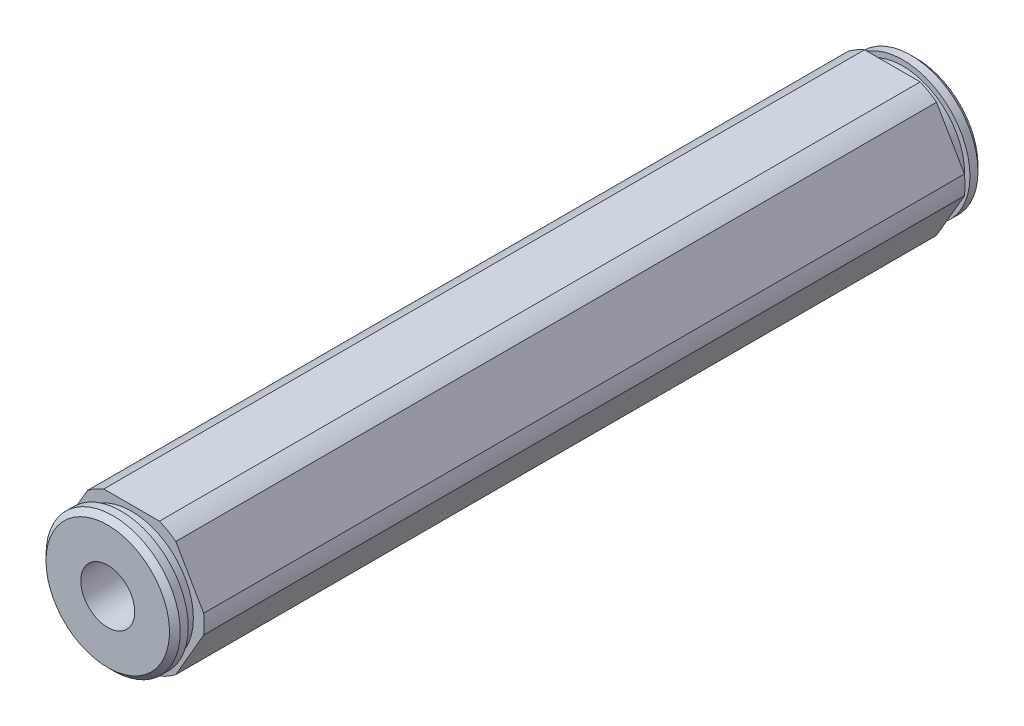
ISO-10303-21;
HEADER;
FILE_DESCRIPTION(('STEP AP214'),'2;1');
FILE_NAME('part.step','',(''),(''),'','','');
FILE_SCHEMA(('AUTOMOTIVE_DESIGN { 1 0 10303 214 1 1 1 1 }'));
ENDSEC;
DATA;
#1=APPLICATION_CONTEXT('core data for automotive mechanical design processes');
#2=APPLICATION_PROTOCOL_DEFINITION('international standard','automotive_design',2000,#1);
#3=PRODUCT_CONTEXT('',#1,'mechanical');
#4=PRODUCT('Part','Part','',(#3));
#5=PRODUCT_RELATED_PRODUCT_CATEGORY('part','',(#4));
#6=PRODUCT_DEFINITION_FORMATION('','',#4);
#7=PRODUCT_DEFINITION_CONTEXT('part definition',#1,'design');
#8=PRODUCT_DEFINITION('design','',#6,#7);
#9=PRODUCT_DEFINITION_SHAPE('','',#8);
#10=(LENGTH_UNIT() NAMED_UNIT(*) SI_UNIT(.MILLI.,.METRE.));
#11=(NAMED_UNIT(*) PLANE_ANGLE_UNIT() SI_UNIT($,.RADIAN.));
#12=(NAMED_UNIT(*) SI_UNIT($,.STERADIAN.) SOLID_ANGLE_UNIT());
#13=UNCERTAINTY_MEASURE_WITH_UNIT(LENGTH_MEASURE(1.E-05),#10,'distance_accuracy_value','');
#14=(GEOMETRIC_REPRESENTATION_CONTEXT(3) GLOBAL_UNCERTAINTY_ASSIGNED_CONTEXT((#13)) GLOBAL_UNIT_ASSIGNED_CONTEXT((#10,
#11,#12)) REPRESENTATION_CONTEXT('',''));
#15=CARTESIAN_POINT('',(0.,0.,0.));
#16=DIRECTION('',(0.,0.,1.));
#17=DIRECTION('',(1.,0.,0.));
#18=AXIS2_PLACEMENT_3D('',#15,#16,#17);
#19=CARTESIAN_POINT('',(0.,5.84199999999999,-2.26060000000002));
#20=DIRECTION('',(0.,0.,-1.));
#21=DIRECTION('',(-1.,0.,0.));
#22=AXIS2_PLACEMENT_3D('',#19,#20,#21);
#23=PLANE('',#22);
#24=CARTESIAN_POINT('',(0.,0.,-2.26060000000002));
#25=DIRECTION('',(0.,0.,1.));
#26=DIRECTION('',(1.,0.,0.));
#27=AXIS2_PLACEMENT_3D('',#24,#25,#26);
#28=CIRCLE('',#27,5.84199999999999);
#29=CARTESIAN_POINT('',(5.84199999999999,0.,-2.26060000000002));
#30=VERTEX_POINT('',#29);
#31=EDGE_CURVE('E194',#30,#30,#28,.T.);
#32=ORIENTED_EDGE('',*,*,#31,.F.);
#33=EDGE_LOOP('',(#32));
#34=FACE_BOUND('',#33,.T.);
#35=DIRECTION('',(0.5,0.866025403784439,0.));
#36=VECTOR('',#35,1.);
#37=CARTESIAN_POINT('',(-2.96960110957685,7.55649999999999,-2.26060000000002));
#38=LINE('',#37,#36);
#39=CARTESIAN_POINT('',(-6.81675182633099,0.893039494206786,-2.26060000000002));
#40=VERTEX_POINT('',#39);
#41=CARTESIAN_POINT('',(-4.18177080173138,5.45696050579321,-2.26060000000002));
#42=VERTEX_POINT('',#41);
#43=EDGE_CURVE('E139',#40,#42,#38,.T.);
#44=ORIENTED_EDGE('',*,*,#43,.F.);
#45=CARTESIAN_POINT('',(0.,0.,-2.26060000000002));
#46=DIRECTION('',(0.,0.,-1.));
#47=DIRECTION('',(-1.,0.,0.));
#48=AXIS2_PLACEMENT_3D('',#45,#46,#47);
#49=CIRCLE('',#48,6.875);
#50=CARTESIAN_POINT('',(-6.81675182633099,-0.893039494206791,-2.26060000000002));
#51=VERTEX_POINT('',#50);
#52=EDGE_CURVE('E183',#51,#40,#49,.T.);
#53=ORIENTED_EDGE('',*,*,#52,.F.);
#54=DIRECTION('',(-0.5,0.866025403784439,0.));
#55=VECTOR('',#54,1.);
#56=CARTESIAN_POINT('',(-8.02892151848553,1.20649999999999,-2.26060000000002));
#57=LINE('',#56,#55);
#58=CARTESIAN_POINT('',(-4.18177080173138,-5.45696050579321,-2.26060000000002));
#59=VERTEX_POINT('',#58);
#60=EDGE_CURVE('E171',#59,#51,#57,.T.);
#61=ORIENTED_EDGE('',*,*,#60,.F.);
#62=CARTESIAN_POINT('',(0.,0.,-2.26060000000002));
#63=DIRECTION('',(0.,0.,-1.));
#64=DIRECTION('',(-1.,0.,0.));
#65=AXIS2_PLACEMENT_3D('',#62,#63,#64);
#66=CIRCLE('',#65,6.875);
#67=CARTESIAN_POINT('',(-2.6349810245996,-6.35,-2.26060000000002));
#68=VERTEX_POINT('',#67);
#69=EDGE_CURVE('E181',#68,#59,#66,.T.);
#70=ORIENTED_EDGE('',*,*,#69,.F.);
#71=DIRECTION('',(-1.,0.,0.));
#72=VECTOR('',#71,1.);
#73=CARTESIAN_POINT('',(0.,-6.35,-2.26060000000002));
#74=LINE('',#73,#72);
#75=CARTESIAN_POINT('',(2.6349810245996,-6.35,-2.26060000000002));
#76=VERTEX_POINT('',#75);
#77=EDGE_CURVE('E167',#76,#68,#74,.T.);
#78=ORIENTED_EDGE('',*,*,#77,.F.);
#79=CARTESIAN_POINT('',(0.,0.,-2.26060000000002));
#80=DIRECTION('',(0.,0.,-1.));
#81=DIRECTION('',(-1.,0.,0.));
#82=AXIS2_PLACEMENT_3D('',#79,#80,#81);
#83=CIRCLE('',#82,6.875);
#84=CARTESIAN_POINT('',(4.18177080173138,-5.45696050579321,-2.26060000000002));
#85=VERTEX_POINT('',#84);
#86=EDGE_CURVE('E179',#85,#76,#83,.T.);
#87=ORIENTED_EDGE('',*,*,#86,.F.);
#88=DIRECTION('',(-0.499999999999999,-0.866025403784439,0.));
#89=VECTOR('',#88,1.);
#90=CARTESIAN_POINT('',(8.02892151848553,1.2065,-2.26060000000002));
#91=LINE('',#90,#89);
#92=CARTESIAN_POINT('',(6.81675182633099,-0.893039494206784,-2.26060000000002));
#93=VERTEX_POINT('',#92);
#94=EDGE_CURVE('E163',#93,#85,#91,.T.);
#95=ORIENTED_EDGE('',*,*,#94,.F.);
#96=CARTESIAN_POINT('',(0.,0.,-2.26060000000002));
#97=DIRECTION('',(0.,0.,-1.));
#98=DIRECTION('',(-1.,0.,0.));
#99=AXIS2_PLACEMENT_3D('',#96,#97,#98);
#100=CIRCLE('',#99,6.875);
#101=CARTESIAN_POINT('',(6.81675182633099,0.893039494206786,-2.26060000000002));
#102=VERTEX_POINT('',#101);
#103=EDGE_CURVE('E177',#102,#93,#100,.T.);
#104=ORIENTED_EDGE('',*,*,#103,.F.);
#105=DIRECTION('',(0.5,-0.866025403784438,0.));
#106=VECTOR('',#105,1.);
#107=CARTESIAN_POINT('',(2.96960110957684,7.55649999999999,-2.26060000000002));
#108=LINE('',#107,#106);
#109=CARTESIAN_POINT('',(4.18177080173138,5.45696050579321,-2.26060000000002));
#110=VERTEX_POINT('',#109);
#111=EDGE_CURVE('E155',#110,#102,#108,.T.);
#112=ORIENTED_EDGE('',*,*,#111,.F.);
#113=CARTESIAN_POINT('',(0.,0.,-2.26060000000002));
#114=DIRECTION('',(0.,0.,-1.));
#115=DIRECTION('',(-1.,0.,0.));
#116=AXIS2_PLACEMENT_3D('',#113,#114,#115);
#117=CIRCLE('',#116,6.875);
#118=CARTESIAN_POINT('',(2.6349810245996,6.35,-2.26060000000002));
#119=VERTEX_POINT('',#118);
#120=EDGE_CURVE('E138',#119,#110,#117,.T.);
#121=ORIENTED_EDGE('',*,*,#120,.F.);
#122=DIRECTION('',(1.,0.,0.));
#123=VECTOR('',#122,1.);
#124=CARTESIAN_POINT('',(0.,6.35,-2.26060000000002));
#125=LINE('',#124,#123);
#126=CARTESIAN_POINT('',(-2.63498102459961,6.35,-2.26060000000002));
#127=VERTEX_POINT('',#126);
#128=EDGE_CURVE('E144',#127,#119,#125,.T.);
#129=ORIENTED_EDGE('',*,*,#128,.F.);
#130=CARTESIAN_POINT('',(0.,0.,-2.26060000000002));
#131=DIRECTION('',(0.,0.,-1.));
#132=DIRECTION('',(-1.,0.,0.));
#133=AXIS2_PLACEMENT_3D('',#130,#131,#132);
#134=CIRCLE('',#133,6.875);
#135=EDGE_CURVE('E133',#42,#127,#134,.T.);
#136=ORIENTED_EDGE('',*,*,#135,.F.);
#137=EDGE_LOOP('',(#44,#53,#61,#70,#78,#87,#95,#104,#112,#121,#129,#136));
#138=FACE_BOUND('',#137,.T.);
#139=ADVANCED_FACE('F47',(#34,#138),#23,.F.);
#140=CARTESIAN_POINT('',(0.,0.,0.));
#141=DIRECTION('',(0.,0.,-1.));
#142=DIRECTION('',(-1.,0.,0.));
#143=AXIS2_PLACEMENT_3D('',#140,#141,#142);
#144=PLANE('',#143);
#145=CARTESIAN_POINT('',(0.,0.,0.));
#146=DIRECTION('',(0.,0.,-1.));
#147=DIRECTION('',(-1.,0.,0.));
#148=AXIS2_PLACEMENT_3D('',#145,#146,#147);
#149=CIRCLE('',#148,5.842);
#150=CARTESIAN_POINT('',(-5.842,0.,0.));
#151=VERTEX_POINT('',#150);
#152=EDGE_CURVE('E55',#151,#151,#149,.F.);
#153=ORIENTED_EDGE('',*,*,#152,.T.);
#154=EDGE_LOOP('',(#153));
#155=FACE_BOUND('',#154,.T.);
#156=CARTESIAN_POINT('',(0.,0.,0.));
#157=DIRECTION('',(0.,0.,-1.));
#158=DIRECTION('',(-1.,0.,0.));
#159=AXIS2_PLACEMENT_3D('',#156,#157,#158);
#160=CIRCLE('',#159,2.5527);
#161=CARTESIAN_POINT('',(-2.5527,0.,0.));
#162=VERTEX_POINT('',#161);
#163=EDGE_CURVE('E476',#162,#162,#160,.F.);
#164=ORIENTED_EDGE('',*,*,#163,.F.);
#165=EDGE_LOOP('',(#164));
#166=FACE_BOUND('',#165,.T.);
#167=ADVANCED_FACE('F223',(#155,#166),#144,.F.);
#168=CARTESIAN_POINT('',(0.,0.,0.));
#169=DIRECTION('',(0.,0.,1.));
#170=DIRECTION('',(1.,0.,0.));
#171=AXIS2_PLACEMENT_3D('',#168,#169,#170);
#172=CYLINDRICAL_SURFACE('',#171,6.35);
#173=CARTESIAN_POINT('',(0.,0.,-0.508000000000001));
#174=DIRECTION('',(0.,0.,-1.));
#175=DIRECTION('',(-1.,0.,0.));
#176=AXIS2_PLACEMENT_3D('',#173,#174,#175);
#177=CIRCLE('',#176,6.35);
#178=CARTESIAN_POINT('',(-6.35,0.,-0.508000000000001));
#179=VERTEX_POINT('',#178);
#180=EDGE_CURVE('E13',#179,#179,#177,.T.);
#181=ORIENTED_EDGE('',*,*,#180,.T.);
#182=EDGE_LOOP('',(#181));
#183=FACE_BOUND('',#182,.T.);
#184=CARTESIAN_POINT('',(0.,0.,-1.26999999999999));
#185=DIRECTION('',(0.,0.,1.));
#186=DIRECTION('',(1.,0.,0.));
#187=AXIS2_PLACEMENT_3D('',#184,#185,#186);
#188=CIRCLE('',#187,6.35);
#189=CARTESIAN_POINT('',(6.35,0.,-1.26999999999999));
#190=VERTEX_POINT('',#189);
#191=EDGE_CURVE('E200',#190,#190,#188,.T.);
#192=ORIENTED_EDGE('',*,*,#191,.T.);
#193=EDGE_LOOP('',(#192));
#194=FACE_BOUND('',#193,.T.);
#195=ADVANCED_FACE('F241',(#183,#194),#172,.T.);
#196=CARTESIAN_POINT('',(0.,6.35,-1.26999999999999));
#197=DIRECTION('',(0.,0.,1.));
#198=DIRECTION('',(1.,0.,0.));
#199=AXIS2_PLACEMENT_3D('',#196,#197,#198);
#200=PLANE('',#199);
#201=ORIENTED_EDGE('',*,*,#191,.F.);
#202=EDGE_LOOP('',(#201));
#203=FACE_BOUND('',#202,.T.);
#204=CARTESIAN_POINT('',(0.,0.,-1.26999999999999));
#205=DIRECTION('',(0.,0.,1.));
#206=DIRECTION('',(1.,0.,0.));
#207=AXIS2_PLACEMENT_3D('',#204,#205,#206);
#208=CIRCLE('',#207,5.84199999999999);
#209=CARTESIAN_POINT('',(5.84199999999999,0.,-1.26999999999999));
#210=VERTEX_POINT('',#209);
#211=EDGE_CURVE('E197',#210,#210,#208,.T.);
#212=ORIENTED_EDGE('',*,*,#211,.T.);
#213=EDGE_LOOP('',(#212));
#214=FACE_BOUND('',#213,.T.);
#215=ADVANCED_FACE('F252',(#203,#214),#200,.F.);
#216=CARTESIAN_POINT('',(0.,0.,0.));
#217=DIRECTION('',(0.,0.,1.));
#218=DIRECTION('',(1.,0.,0.));
#219=AXIS2_PLACEMENT_3D('',#216,#217,#218);
#220=CYLINDRICAL_SURFACE('',#219,5.84199999999999);
#221=ORIENTED_EDGE('',*,*,#211,.F.);
#222=EDGE_LOOP('',(#221));
#223=FACE_BOUND('',#222,.T.);
#224=ORIENTED_EDGE('',*,*,#31,.T.);
#225=EDGE_LOOP('',(#224));
#226=FACE_BOUND('',#225,.T.);
#227=ADVANCED_FACE('F248',(#223,#226),#220,.T.);
#228=CARTESIAN_POINT('',(0.,0.,-98.057414690566));
#229=DIRECTION('',(0.,0.,1.));
#230=DIRECTION('',(1.,0.,0.));
#231=AXIS2_PLACEMENT_3D('',#228,#229,#230);
#232=CYLINDRICAL_SURFACE('',#231,6.875);
#233=ORIENTED_EDGE('',*,*,#52,.T.);
#234=DIRECTION('',(0.,0.,1.));
#235=VECTOR('',#234,1.);
#236=CARTESIAN_POINT('',(-6.81675182633099,0.893039494206786,-98.057414690566));
#237=LINE('',#236,#235);
#238=CARTESIAN_POINT('',(-6.81675182633099,0.893039494206786,-74.2442));
#239=VERTEX_POINT('',#238);
#240=EDGE_CURVE('E509',#239,#40,#237,.T.);
#241=ORIENTED_EDGE('',*,*,#240,.F.);
#242=CARTESIAN_POINT('',(0.,0.,-74.2442));
#243=DIRECTION('',(0.,0.,1.));
#244=DIRECTION('',(1.,0.,0.));
#245=AXIS2_PLACEMENT_3D('',#242,#243,#244);
#246=CIRCLE('',#245,6.875);
#247=CARTESIAN_POINT('',(-6.81675182633099,-0.893039494206791,-74.2442));
#248=VERTEX_POINT('',#247);
#249=EDGE_CURVE('E213',#239,#248,#246,.T.);
#250=ORIENTED_EDGE('',*,*,#249,.T.);
#251=DIRECTION('',(0.,0.,1.));
#252=VECTOR('',#251,1.);
#253=CARTESIAN_POINT('',(-6.81675182633099,-0.893039494206791,-98.057414690566));
#254=LINE('',#253,#252);
#255=EDGE_CURVE('E506',#248,#51,#254,.T.);
#256=ORIENTED_EDGE('',*,*,#255,.T.);
#257=EDGE_LOOP('',(#233,#241,#250,#256));
#258=FACE_BOUND('',#257,.T.);
#259=ADVANCED_FACE('F251',(#258),#232,.T.);
#260=CARTESIAN_POINT('',(0.,0.,-98.057414690566));
#261=DIRECTION('',(0.,0.,1.));
#262=DIRECTION('',(1.,0.,0.));
#263=AXIS2_PLACEMENT_3D('',#260,#261,#262);
#264=CYLINDRICAL_SURFACE('',#263,6.875);
#265=ORIENTED_EDGE('',*,*,#69,.T.);
#266=DIRECTION('',(0.,0.,1.));
#267=VECTOR('',#266,1.);
#268=CARTESIAN_POINT('',(-4.18177080173138,-5.45696050579321,-98.057414690566));
#269=LINE('',#268,#267);
#270=CARTESIAN_POINT('',(-4.18177080173138,-5.45696050579321,-74.2442));
#271=VERTEX_POINT('',#270);
#272=EDGE_CURVE('E503',#271,#59,#269,.T.);
#273=ORIENTED_EDGE('',*,*,#272,.F.);
#274=CARTESIAN_POINT('',(0.,0.,-74.2442));
#275=DIRECTION('',(0.,0.,1.));
#276=DIRECTION('',(1.,0.,0.));
#277=AXIS2_PLACEMENT_3D('',#274,#275,#276);
#278=CIRCLE('',#277,6.875);
#279=CARTESIAN_POINT('',(-2.6349810245996,-6.35,-74.2442));
#280=VERTEX_POINT('',#279);
#281=EDGE_CURVE('E211',#271,#280,#278,.T.);
#282=ORIENTED_EDGE('',*,*,#281,.T.);
#283=DIRECTION('',(0.,0.,1.));
#284=VECTOR('',#283,1.);
#285=CARTESIAN_POINT('',(-2.6349810245996,-6.35,-98.057414690566));
#286=LINE('',#285,#284);
#287=EDGE_CURVE('E500',#280,#68,#286,.T.);
#288=ORIENTED_EDGE('',*,*,#287,.T.);
#289=EDGE_LOOP('',(#265,#273,#282,#288));
#290=FACE_BOUND('',#289,.T.);
#291=ADVANCED_FACE('F284',(#290),#264,.T.);
#292=CARTESIAN_POINT('',(0.,0.,-98.057414690566));
#293=DIRECTION('',(0.,0.,1.));
#294=DIRECTION('',(1.,0.,0.));
#295=AXIS2_PLACEMENT_3D('',#292,#293,#294);
#296=CYLINDRICAL_SURFACE('',#295,6.875);
#297=ORIENTED_EDGE('',*,*,#86,.T.);
#298=DIRECTION('',(0.,0.,1.));
#299=VECTOR('',#298,1.);
#300=CARTESIAN_POINT('',(2.6349810245996,-6.35,-98.057414690566));
#301=LINE('',#300,#299);
#302=CARTESIAN_POINT('',(2.6349810245996,-6.35,-74.2442));
#303=VERTEX_POINT('',#302);
#304=EDGE_CURVE('E497',#303,#76,#301,.T.);
#305=ORIENTED_EDGE('',*,*,#304,.F.);
#306=CARTESIAN_POINT('',(0.,0.,-74.2442));
#307=DIRECTION('',(0.,0.,1.));
#308=DIRECTION('',(1.,0.,0.));
#309=AXIS2_PLACEMENT_3D('',#306,#307,#308);
#310=CIRCLE('',#309,6.875);
#311=CARTESIAN_POINT('',(4.18177080173138,-5.45696050579321,-74.2442));
#312=VERTEX_POINT('',#311);
#313=EDGE_CURVE('E209',#303,#312,#310,.T.);
#314=ORIENTED_EDGE('',*,*,#313,.T.);
#315=DIRECTION('',(0.,0.,1.));
#316=VECTOR('',#315,1.);
#317=CARTESIAN_POINT('',(4.18177080173138,-5.45696050579321,-98.057414690566));
#318=LINE('',#317,#316);
#319=EDGE_CURVE('E494',#312,#85,#318,.T.);
#320=ORIENTED_EDGE('',*,*,#319,.T.);
#321=EDGE_LOOP('',(#297,#305,#314,#320));
#322=FACE_BOUND('',#321,.T.);
#323=ADVANCED_FACE('F292',(#322),#296,.T.);
#324=CARTESIAN_POINT('',(0.,0.,-98.057414690566));
#325=DIRECTION('',(0.,0.,1.));
#326=DIRECTION('',(1.,0.,0.));
#327=AXIS2_PLACEMENT_3D('',#324,#325,#326);
#328=CYLINDRICAL_SURFACE('',#327,6.875);
#329=ORIENTED_EDGE('',*,*,#103,.T.);
#330=DIRECTION('',(0.,0.,1.));
#331=VECTOR('',#330,1.);
#332=CARTESIAN_POINT('',(6.81675182633099,-0.893039494206784,-98.057414690566));
#333=LINE('',#332,#331);
#334=CARTESIAN_POINT('',(6.81675182633099,-0.893039494206784,-74.2442));
#335=VERTEX_POINT('',#334);
#336=EDGE_CURVE('E491',#335,#93,#333,.T.);
#337=ORIENTED_EDGE('',*,*,#336,.F.);
#338=CARTESIAN_POINT('',(0.,0.,-74.2442));
#339=DIRECTION('',(0.,0.,1.));
#340=DIRECTION('',(1.,0.,0.));
#341=AXIS2_PLACEMENT_3D('',#338,#339,#340);
#342=CIRCLE('',#341,6.875);
#343=CARTESIAN_POINT('',(6.81675182633099,0.893039494206786,-74.2442));
#344=VERTEX_POINT('',#343);
#345=EDGE_CURVE('E207',#335,#344,#342,.T.);
#346=ORIENTED_EDGE('',*,*,#345,.T.);
#347=DIRECTION('',(0.,0.,1.));
#348=VECTOR('',#347,1.);
#349=CARTESIAN_POINT('',(6.81675182633099,0.893039494206786,-98.057414690566));
#350=LINE('',#349,#348);
#351=EDGE_CURVE('E488',#344,#102,#350,.T.);
#352=ORIENTED_EDGE('',*,*,#351,.T.);
#353=EDGE_LOOP('',(#329,#337,#346,#352));
#354=FACE_BOUND('',#353,.T.);
#355=ADVANCED_FACE('F300',(#354),#328,.T.);
#356=CARTESIAN_POINT('',(0.,0.,-98.057414690566));
#357=DIRECTION('',(0.,0.,1.));
#358=DIRECTION('',(1.,0.,0.));
#359=AXIS2_PLACEMENT_3D('',#356,#357,#358);
#360=CYLINDRICAL_SURFACE('',#359,6.875);
#361=ORIENTED_EDGE('',*,*,#120,.T.);
#362=DIRECTION('',(0.,0.,1.));
#363=VECTOR('',#362,1.);
#364=CARTESIAN_POINT('',(4.18177080173138,5.45696050579321,-98.057414690566));
#365=LINE('',#364,#363);
#366=CARTESIAN_POINT('',(4.18177080173138,5.45696050579321,-74.2442));
#367=VERTEX_POINT('',#366);
#368=EDGE_CURVE('E485',#367,#110,#365,.T.);
#369=ORIENTED_EDGE('',*,*,#368,.F.);
#370=CARTESIAN_POINT('',(0.,0.,-74.2442));
#371=DIRECTION('',(0.,0.,1.));
#372=DIRECTION('',(1.,0.,0.));
#373=AXIS2_PLACEMENT_3D('',#370,#371,#372);
#374=CIRCLE('',#373,6.875);
#375=CARTESIAN_POINT('',(2.6349810245996,6.35,-74.2442));
#376=VERTEX_POINT('',#375);
#377=EDGE_CURVE('E205',#367,#376,#374,.T.);
#378=ORIENTED_EDGE('',*,*,#377,.T.);
#379=DIRECTION('',(0.,0.,1.));
#380=VECTOR('',#379,1.);
#381=CARTESIAN_POINT('',(2.6349810245996,6.35,-98.057414690566));
#382=LINE('',#381,#380);
#383=EDGE_CURVE('E149',#376,#119,#382,.T.);
#384=ORIENTED_EDGE('',*,*,#383,.T.);
#385=EDGE_LOOP('',(#361,#369,#378,#384));
#386=FACE_BOUND('',#385,.T.);
#387=ADVANCED_FACE('F308',(#386),#360,.T.);
#388=CARTESIAN_POINT('',(0.,0.,-98.057414690566));
#389=DIRECTION('',(0.,0.,1.));
#390=DIRECTION('',(1.,0.,0.));
#391=AXIS2_PLACEMENT_3D('',#388,#389,#390);
#392=CYLINDRICAL_SURFACE('',#391,6.875);
#393=ORIENTED_EDGE('',*,*,#135,.T.);
#394=DIRECTION('',(0.,0.,1.));
#395=VECTOR('',#394,1.);
#396=CARTESIAN_POINT('',(-2.63498102459961,6.35,-98.057414690566));
#397=LINE('',#396,#395);
#398=CARTESIAN_POINT('',(-2.63498102459961,6.35,-74.2442));
#399=VERTEX_POINT('',#398);
#400=EDGE_CURVE('E67',#399,#127,#397,.T.);
#401=ORIENTED_EDGE('',*,*,#400,.F.);
#402=CARTESIAN_POINT('',(0.,0.,-74.2442));
#403=DIRECTION('',(0.,0.,1.));
#404=DIRECTION('',(1.,0.,0.));
#405=AXIS2_PLACEMENT_3D('',#402,#403,#404);
#406=CIRCLE('',#405,6.875);
#407=CARTESIAN_POINT('',(-4.18177080173138,5.45696050579321,-74.2442));
#408=VERTEX_POINT('',#407);
#409=EDGE_CURVE('E203',#399,#408,#406,.T.);
#410=ORIENTED_EDGE('',*,*,#409,.T.);
#411=DIRECTION('',(0.,0.,1.));
#412=VECTOR('',#411,1.);
#413=CARTESIAN_POINT('',(-4.18177080173138,5.45696050579321,-98.057414690566));
#414=LINE('',#413,#412);
#415=EDGE_CURVE('E62',#408,#42,#414,.T.);
#416=ORIENTED_EDGE('',*,*,#415,.T.);
#417=EDGE_LOOP('',(#393,#401,#410,#416));
#418=FACE_BOUND('',#417,.T.);
#419=ADVANCED_FACE('F134',(#418),#392,.T.);
#420=CARTESIAN_POINT('',(-4.18177080173138,5.45696050579321,-98.057414690566));
#421=DIRECTION('',(-0.866025403784439,0.5,0.));
#422=DIRECTION('',(-0.5,-0.866025403784439,0.));
#423=AXIS2_PLACEMENT_3D('',#420,#421,#422);
#424=PLANE('',#423);
#425=ORIENTED_EDGE('',*,*,#43,.T.);
#426=ORIENTED_EDGE('',*,*,#415,.F.);
#427=DIRECTION('',(-0.5,-0.866025403784439,0.));
#428=VECTOR('',#427,1.);
#429=CARTESIAN_POINT('',(-2.96960110957684,7.5565,-74.2442));
#430=LINE('',#429,#428);
#431=EDGE_CURVE('E173',#408,#239,#430,.T.);
#432=ORIENTED_EDGE('',*,*,#431,.T.);
#433=ORIENTED_EDGE('',*,*,#240,.T.);
#434=EDGE_LOOP('',(#425,#426,#432,#433));
#435=FACE_BOUND('',#434,.T.);
#436=ADVANCED_FACE('F323',(#435),#424,.T.);
#437=CARTESIAN_POINT('',(-6.81675182633099,-0.893039494206793,-98.057414690566));
#438=DIRECTION('',(-0.866025403784439,-0.5,0.));
#439=DIRECTION('',(0.5,-0.866025403784439,0.));
#440=AXIS2_PLACEMENT_3D('',#437,#438,#439);
#441=PLANE('',#440);
#442=ORIENTED_EDGE('',*,*,#60,.T.);
#443=ORIENTED_EDGE('',*,*,#255,.F.);
#444=DIRECTION('',(0.5,-0.866025403784439,0.));
#445=VECTOR('',#444,1.);
#446=CARTESIAN_POINT('',(-8.02892151848553,1.2065,-74.2442));
#447=LINE('',#446,#445);
#448=EDGE_CURVE('E169',#248,#271,#447,.T.);
#449=ORIENTED_EDGE('',*,*,#448,.T.);
#450=ORIENTED_EDGE('',*,*,#272,.T.);
#451=EDGE_LOOP('',(#442,#443,#449,#450));
#452=FACE_BOUND('',#451,.T.);
#453=ADVANCED_FACE('F330',(#452),#441,.T.);
#454=CARTESIAN_POINT('',(-2.63498102459961,-6.35,-98.057414690566));
#455=DIRECTION('',(0.,-1.,0.));
#456=DIRECTION('',(0.,0.,-1.));
#457=AXIS2_PLACEMENT_3D('',#454,#455,#456);
#458=PLANE('',#457);
#459=ORIENTED_EDGE('',*,*,#77,.T.);
#460=ORIENTED_EDGE('',*,*,#287,.F.);
#461=DIRECTION('',(1.,0.,0.));
#462=VECTOR('',#461,1.);
#463=CARTESIAN_POINT('',(0.,-6.35,-74.2442));
#464=LINE('',#463,#462);
#465=EDGE_CURVE('E165',#280,#303,#464,.T.);
#466=ORIENTED_EDGE('',*,*,#465,.T.);
#467=ORIENTED_EDGE('',*,*,#304,.T.);
#468=EDGE_LOOP('',(#459,#460,#466,#467));
#469=FACE_BOUND('',#468,.T.);
#470=ADVANCED_FACE('F338',(#469),#458,.T.);
#471=CARTESIAN_POINT('',(4.18177080173138,-5.45696050579321,-98.057414690566));
#472=DIRECTION('',(0.866025403784439,-0.499999999999999,0.));
#473=DIRECTION('',(0.499999999999999,0.866025403784439,0.));
#474=AXIS2_PLACEMENT_3D('',#471,#472,#473);
#475=PLANE('',#474);
#476=ORIENTED_EDGE('',*,*,#94,.T.);
#477=ORIENTED_EDGE('',*,*,#319,.F.);
#478=DIRECTION('',(0.499999999999999,0.866025403784439,0.));
#479=VECTOR('',#478,1.);
#480=CARTESIAN_POINT('',(8.02892151848553,1.20650000000001,-74.2442));
#481=LINE('',#480,#479);
#482=EDGE_CURVE('E161',#312,#335,#481,.T.);
#483=ORIENTED_EDGE('',*,*,#482,.T.);
#484=ORIENTED_EDGE('',*,*,#336,.T.);
#485=EDGE_LOOP('',(#476,#477,#483,#484));
#486=FACE_BOUND('',#485,.T.);
#487=ADVANCED_FACE('F346',(#486),#475,.T.);
#488=CARTESIAN_POINT('',(6.81675182633099,0.893039494206787,-98.057414690566));
#489=DIRECTION('',(0.866025403784438,0.5,0.));
#490=DIRECTION('',(-0.5,0.866025403784438,0.));
#491=AXIS2_PLACEMENT_3D('',#488,#489,#490);
#492=PLANE('',#491);
#493=ORIENTED_EDGE('',*,*,#111,.T.);
#494=ORIENTED_EDGE('',*,*,#351,.F.);
#495=DIRECTION('',(-0.5,0.866025403784438,0.));
#496=VECTOR('',#495,1.);
#497=CARTESIAN_POINT('',(2.96960110957684,7.5565,-74.2442));
#498=LINE('',#497,#496);
#499=EDGE_CURVE('E153',#344,#367,#498,.T.);
#500=ORIENTED_EDGE('',*,*,#499,.T.);
#501=ORIENTED_EDGE('',*,*,#368,.T.);
#502=EDGE_LOOP('',(#493,#494,#500,#501));
#503=FACE_BOUND('',#502,.T.);
#504=ADVANCED_FACE('F354',(#503),#492,.T.);
#505=CARTESIAN_POINT('',(2.6349810245996,6.35,-98.057414690566));
#506=DIRECTION('',(0.,1.,0.));
#507=DIRECTION('',(-1.,0.,0.));
#508=AXIS2_PLACEMENT_3D('',#505,#506,#507);
#509=PLANE('',#508);
#510=ORIENTED_EDGE('',*,*,#128,.T.);
#511=ORIENTED_EDGE('',*,*,#383,.F.);
#512=DIRECTION('',(-1.,0.,0.));
#513=VECTOR('',#512,1.);
#514=CARTESIAN_POINT('',(0.,6.35,-74.2442));
#515=LINE('',#514,#513);
#516=EDGE_CURVE('E147',#376,#399,#515,.T.);
#517=ORIENTED_EDGE('',*,*,#516,.T.);
#518=ORIENTED_EDGE('',*,*,#400,.T.);
#519=EDGE_LOOP('',(#510,#511,#517,#518));
#520=FACE_BOUND('',#519,.T.);
#521=ADVANCED_FACE('F142',(#520),#509,.T.);
#522=CARTESIAN_POINT('',(0.,0.,-76.5048));
#523=DIRECTION('',(0.,0.,1.));
#524=DIRECTION('',(1.,0.,0.));
#525=AXIS2_PLACEMENT_3D('',#522,#523,#524);
#526=PLANE('',#525);
#527=CARTESIAN_POINT('',(0.,0.,-76.5048));
#528=DIRECTION('',(0.,0.,1.));
#529=DIRECTION('',(1.,0.,0.));
#530=AXIS2_PLACEMENT_3D('',#527,#528,#529);
#531=CIRCLE('',#530,5.842);
#532=CARTESIAN_POINT('',(5.842,0.,-76.5048));
#533=VERTEX_POINT('',#532);
#534=EDGE_CURVE('E218',#533,#533,#531,.F.);
#535=ORIENTED_EDGE('',*,*,#534,.T.);
#536=EDGE_LOOP('',(#535));
#537=FACE_BOUND('',#536,.T.);
#538=CARTESIAN_POINT('',(0.,0.,-76.5048));
#539=DIRECTION('',(0.,0.,-1.));
#540=DIRECTION('',(0.,1.,0.));
#541=AXIS2_PLACEMENT_3D('',#538,#539,#540);
#542=CIRCLE('',#541,2.5527);
#543=CARTESIAN_POINT('',(0.,2.5527,-76.5048));
#544=VERTEX_POINT('',#543);
#545=EDGE_CURVE('E479',#544,#544,#542,.T.);
#546=ORIENTED_EDGE('',*,*,#545,.F.);
#547=EDGE_LOOP('',(#546));
#548=FACE_BOUND('',#547,.T.);
#549=ADVANCED_FACE('F369',(#537,#548),#526,.F.);
#550=CARTESIAN_POINT('',(0.,0.,0.));
#551=DIRECTION('',(0.,0.,1.));
#552=DIRECTION('',(1.,0.,0.));
#553=AXIS2_PLACEMENT_3D('',#550,#551,#552);
#554=CYLINDRICAL_SURFACE('',#553,6.35);
#555=CARTESIAN_POINT('',(0.,0.,-75.9968));
#556=DIRECTION('',(0.,0.,1.));
#557=DIRECTION('',(1.,0.,0.));
#558=AXIS2_PLACEMENT_3D('',#555,#556,#557);
#559=CIRCLE('',#558,6.35);
#560=CARTESIAN_POINT('',(6.35,0.,-75.9968));
#561=VERTEX_POINT('',#560);
#562=EDGE_CURVE('E215',#561,#561,#559,.T.);
#563=ORIENTED_EDGE('',*,*,#562,.T.);
#564=EDGE_LOOP('',(#563));
#565=FACE_BOUND('',#564,.T.);
#566=CARTESIAN_POINT('',(0.,0.,-75.2348));
#567=DIRECTION('',(0.,0.,1.));
#568=DIRECTION('',(1.,0.,0.));
#569=AXIS2_PLACEMENT_3D('',#566,#567,#568);
#570=CIRCLE('',#569,6.35);
#571=CARTESIAN_POINT('',(6.35,0.,-75.2348));
#572=VERTEX_POINT('',#571);
#573=EDGE_CURVE('E185',#572,#572,#570,.T.);
#574=ORIENTED_EDGE('',*,*,#573,.F.);
#575=EDGE_LOOP('',(#574));
#576=FACE_BOUND('',#575,.T.);
#577=ADVANCED_FACE('F376',(#565,#576),#554,.T.);
#578=CARTESIAN_POINT('',(0.,6.35,-75.2348));
#579=DIRECTION('',(0.,0.,-1.));
#580=DIRECTION('',(-1.,0.,0.));
#581=AXIS2_PLACEMENT_3D('',#578,#579,#580);
#582=PLANE('',#581);
#583=CARTESIAN_POINT('',(0.,0.,-75.2348));
#584=DIRECTION('',(0.,0.,1.));
#585=DIRECTION('',(1.,0.,0.));
#586=AXIS2_PLACEMENT_3D('',#583,#584,#585);
#587=CIRCLE('',#586,5.842);
#588=CARTESIAN_POINT('',(5.842,0.,-75.2348));
#589=VERTEX_POINT('',#588);
#590=EDGE_CURVE('E188',#589,#589,#587,.T.);
#591=ORIENTED_EDGE('',*,*,#590,.F.);
#592=EDGE_LOOP('',(#591));
#593=FACE_BOUND('',#592,.T.);
#594=ORIENTED_EDGE('',*,*,#573,.T.);
#595=EDGE_LOOP('',(#594));
#596=FACE_BOUND('',#595,.T.);
#597=ADVANCED_FACE('F384',(#593,#596),#582,.F.);
#598=CARTESIAN_POINT('',(0.,0.,0.));
#599=DIRECTION('',(0.,0.,1.));
#600=DIRECTION('',(1.,0.,0.));
#601=AXIS2_PLACEMENT_3D('',#598,#599,#600);
#602=CYLINDRICAL_SURFACE('',#601,5.842);
#603=CARTESIAN_POINT('',(0.,0.,-74.2442));
#604=DIRECTION('',(0.,0.,1.));
#605=DIRECTION('',(1.,0.,0.));
#606=AXIS2_PLACEMENT_3D('',#603,#604,#605);
#607=CIRCLE('',#606,5.842);
#608=CARTESIAN_POINT('',(5.842,0.,-74.2442));
#609=VERTEX_POINT('',#608);
#610=EDGE_CURVE('E191',#609,#609,#607,.T.);
#611=ORIENTED_EDGE('',*,*,#610,.F.);
#612=EDGE_LOOP('',(#611));
#613=FACE_BOUND('',#612,.T.);
#614=ORIENTED_EDGE('',*,*,#590,.T.);
#615=EDGE_LOOP('',(#614));
#616=FACE_BOUND('',#615,.T.);
#617=ADVANCED_FACE('F392',(#613,#616),#602,.T.);
#618=CARTESIAN_POINT('',(0.,5.842,-74.2442));
#619=DIRECTION('',(0.,0.,1.));
#620=DIRECTION('',(1.,0.,0.));
#621=AXIS2_PLACEMENT_3D('',#618,#619,#620);
#622=PLANE('',#621);
#623=ORIENTED_EDGE('',*,*,#610,.T.);
#624=EDGE_LOOP('',(#623));
#625=FACE_BOUND('',#624,.T.);
#626=ORIENTED_EDGE('',*,*,#431,.F.);
#627=ORIENTED_EDGE('',*,*,#409,.F.);
#628=ORIENTED_EDGE('',*,*,#516,.F.);
#629=ORIENTED_EDGE('',*,*,#377,.F.);
#630=ORIENTED_EDGE('',*,*,#499,.F.);
#631=ORIENTED_EDGE('',*,*,#345,.F.);
#632=ORIENTED_EDGE('',*,*,#482,.F.);
#633=ORIENTED_EDGE('',*,*,#313,.F.);
#634=ORIENTED_EDGE('',*,*,#465,.F.);
#635=ORIENTED_EDGE('',*,*,#281,.F.);
#636=ORIENTED_EDGE('',*,*,#448,.F.);
#637=ORIENTED_EDGE('',*,*,#249,.F.);
#638=EDGE_LOOP('',(#626,#627,#628,#629,#630,#631,#632,#633,#634,#635,#636,#637));
#639=FACE_BOUND('',#638,.T.);
#640=ADVANCED_FACE('F246',(#625,#639),#622,.F.);
#641=CARTESIAN_POINT('',(0.,0.,7.22012592133961));
#642=DIRECTION('',(0.,0.,-1.));
#643=DIRECTION('',(0.,1.,0.));
#644=AXIS2_PLACEMENT_3D('',#641,#642,#643);
#645=CYLINDRICAL_SURFACE('',#644,2.5527);
#646=ORIENTED_EDGE('',*,*,#163,.T.);
#647=EDGE_LOOP('',(#646));
#648=FACE_BOUND('',#647,.T.);
#649=ORIENTED_EDGE('',*,*,#545,.T.);
#650=EDGE_LOOP('',(#649));
#651=FACE_BOUND('',#650,.T.);
#652=ADVANCED_FACE('F232',(#648,#651),#645,.F.);
#653=CARTESIAN_POINT('',(0.,0.,-75.9968));
#654=DIRECTION('',(0.,0.,1.));
#655=DIRECTION('',(1.,0.,0.));
#656=AXIS2_PLACEMENT_3D('',#653,#654,#655);
#657=CONICAL_SURFACE('',#656,6.35,0.785398163397453);
#658=ORIENTED_EDGE('',*,*,#534,.F.);
#659=EDGE_LOOP('',(#658));
#660=FACE_BOUND('',#659,.T.);
#661=ORIENTED_EDGE('',*,*,#562,.F.);
#662=EDGE_LOOP('',(#661));
#663=FACE_BOUND('',#662,.T.);
#664=ADVANCED_FACE('F227',(#660,#663),#657,.T.);
#665=CARTESIAN_POINT('',(0.,0.,0.));
#666=DIRECTION('',(0.,0.,-1.));
#667=DIRECTION('',(-1.,0.,0.));
#668=AXIS2_PLACEMENT_3D('',#665,#666,#667);
#669=CONICAL_SURFACE('',#668,5.842,0.785398163397447);
#670=ORIENTED_EDGE('',*,*,#180,.F.);
#671=EDGE_LOOP('',(#670));
#672=FACE_BOUND('',#671,.T.);
#673=ORIENTED_EDGE('',*,*,#152,.F.);
#674=EDGE_LOOP('',(#673));
#675=FACE_BOUND('',#674,.T.);
#676=ADVANCED_FACE('F49',(#672,#675),#669,.T.);
#677=CLOSED_SHELL('',(#139,#167,#195,#215,#227,#259,#291,#323,#355,#387,#419,#436,#453,#470,
#487,#504,#521,#549,#577,#597,#617,#640,#652,#664,#676));
#678=MANIFOLD_SOLID_BREP('B2',#677);
#679=ADVANCED_BREP_SHAPE_REPRESENTATION('',(#18,#678),#14);
#680=SHAPE_DEFINITION_REPRESENTATION(#9,#679);
ENDSEC;
END-ISO-10303-21;
